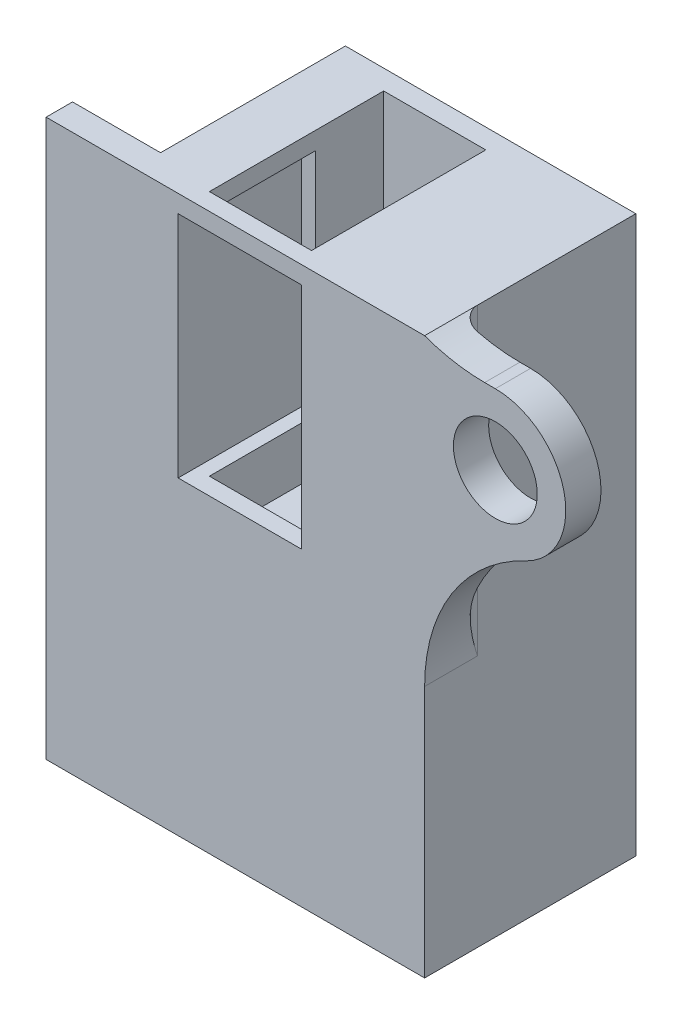
ISO-10303-21;
HEADER;
FILE_DESCRIPTION(('STEP AP214'),'2;1');
FILE_NAME('part.step','',(''),(''),'','','');
FILE_SCHEMA(('AUTOMOTIVE_DESIGN { 1 0 10303 214 1 1 1 1 }'));
ENDSEC;
DATA;
#1=APPLICATION_CONTEXT('core data for automotive mechanical design processes');
#2=APPLICATION_PROTOCOL_DEFINITION('international standard','automotive_design',2000,#1);
#3=PRODUCT_CONTEXT('',#1,'mechanical');
#4=PRODUCT('Part','Part','',(#3));
#5=PRODUCT_RELATED_PRODUCT_CATEGORY('part','',(#4));
#6=PRODUCT_DEFINITION_FORMATION('','',#4);
#7=PRODUCT_DEFINITION_CONTEXT('part definition',#1,'design');
#8=PRODUCT_DEFINITION('design','',#6,#7);
#9=PRODUCT_DEFINITION_SHAPE('','',#8);
#10=(LENGTH_UNIT() NAMED_UNIT(*) SI_UNIT(.MILLI.,.METRE.));
#11=(NAMED_UNIT(*) PLANE_ANGLE_UNIT() SI_UNIT($,.RADIAN.));
#12=(NAMED_UNIT(*) SI_UNIT($,.STERADIAN.) SOLID_ANGLE_UNIT());
#13=UNCERTAINTY_MEASURE_WITH_UNIT(LENGTH_MEASURE(1.E-05),#10,'distance_accuracy_value','');
#14=(GEOMETRIC_REPRESENTATION_CONTEXT(3) GLOBAL_UNCERTAINTY_ASSIGNED_CONTEXT((#13)) GLOBAL_UNIT_ASSIGNED_CONTEXT((#10,
#11,#12)) REPRESENTATION_CONTEXT('',''));
#15=CARTESIAN_POINT('',(0.,0.,0.));
#16=DIRECTION('',(0.,0.,1.));
#17=DIRECTION('',(1.,0.,0.));
#18=AXIS2_PLACEMENT_3D('',#15,#16,#17);
#19=CARTESIAN_POINT('',(0.,0.,-7.));
#20=DIRECTION('',(0.,0.,1.));
#21=DIRECTION('',(1.,0.,0.));
#22=AXIS2_PLACEMENT_3D('',#19,#20,#21);
#23=PLANE('',#22);
#24=DIRECTION('',(0.,-1.,0.));
#25=VECTOR('',#24,1.);
#26=CARTESIAN_POINT('',(3.3,0.,-7.));
#27=LINE('',#26,#25);
#28=CARTESIAN_POINT('',(3.3,32.6,-7.));
#29=VERTEX_POINT('',#28);
#30=CARTESIAN_POINT('',(3.3,19.6,-7.));
#31=VERTEX_POINT('',#30);
#32=EDGE_CURVE('E279',#29,#31,#27,.T.);
#33=ORIENTED_EDGE('',*,*,#32,.F.);
#34=DIRECTION('',(-1.,0.,0.));
#35=VECTOR('',#34,1.);
#36=CARTESIAN_POINT('',(0.,32.6,-7.));
#37=LINE('',#36,#35);
#38=CARTESIAN_POINT('',(2.5,32.6,-7.));
#39=VERTEX_POINT('',#38);
#40=EDGE_CURVE('E345',#29,#39,#37,.T.);
#41=ORIENTED_EDGE('',*,*,#40,.T.);
#42=DIRECTION('',(0.,-1.,0.));
#43=VECTOR('',#42,1.);
#44=CARTESIAN_POINT('',(2.50000000000001,0.,-7.));
#45=LINE('',#44,#43);
#46=CARTESIAN_POINT('',(2.5,19.6,-7.));
#47=VERTEX_POINT('',#46);
#48=EDGE_CURVE('E351',#39,#47,#45,.T.);
#49=ORIENTED_EDGE('',*,*,#48,.T.);
#50=DIRECTION('',(1.,0.,0.));
#51=VECTOR('',#50,1.);
#52=CARTESIAN_POINT('',(0.,19.6,-7.));
#53=LINE('',#52,#51);
#54=EDGE_CURVE('E356',#47,#31,#53,.T.);
#55=ORIENTED_EDGE('',*,*,#54,.T.);
#56=EDGE_LOOP('',(#33,#41,#49,#55));
#57=FACE_BOUND('',#56,.T.);
#58=ADVANCED_FACE('F43',(#57),#23,.T.);
#59=CARTESIAN_POINT('',(0.,0.,0.));
#60=DIRECTION('',(1.,0.,0.));
#61=DIRECTION('',(0.,0.,-1.));
#62=AXIS2_PLACEMENT_3D('',#59,#60,#61);
#63=PLANE('',#62);
#64=DIRECTION('',(0.,0.,1.));
#65=VECTOR('',#64,1.);
#66=CARTESIAN_POINT('',(0.,33.6,-12.));
#67=LINE('',#66,#65);
#68=CARTESIAN_POINT('',(0.,33.6,-12.));
#69=VERTEX_POINT('',#68);
#70=CARTESIAN_POINT('',(0.,33.6,-1.5));
#71=VERTEX_POINT('',#70);
#72=EDGE_CURVE('E304',#69,#71,#67,.T.);
#73=ORIENTED_EDGE('',*,*,#72,.F.);
#74=DIRECTION('',(0.,1.,0.));
#75=VECTOR('',#74,1.);
#76=CARTESIAN_POINT('',(0.,2.,-12.));
#77=LINE('',#76,#75);
#78=CARTESIAN_POINT('',(0.,2.,-12.));
#79=VERTEX_POINT('',#78);
#80=EDGE_CURVE('E288',#79,#69,#77,.T.);
#81=ORIENTED_EDGE('',*,*,#80,.F.);
#82=DIRECTION('',(0.,0.,1.));
#83=VECTOR('',#82,1.);
#84=CARTESIAN_POINT('',(0.,2.,-12.));
#85=LINE('',#84,#83);
#86=CARTESIAN_POINT('',(0.,2.,-1.5));
#87=VERTEX_POINT('',#86);
#88=EDGE_CURVE('E422',#79,#87,#85,.T.);
#89=ORIENTED_EDGE('',*,*,#88,.T.);
#90=DIRECTION('',(0.,-1.,0.));
#91=VECTOR('',#90,1.);
#92=CARTESIAN_POINT('',(0.,37.1,-1.5));
#93=LINE('',#92,#91);
#94=EDGE_CURVE('E321',#71,#87,#93,.T.);
#95=ORIENTED_EDGE('',*,*,#94,.F.);
#96=EDGE_LOOP('',(#73,#81,#89,#95));
#97=FACE_BOUND('',#96,.T.);
#98=ADVANCED_FACE('F492',(#97),#63,.F.);
#99=CARTESIAN_POINT('',(16.5,0.,0.));
#100=DIRECTION('',(0.,0.,-1.));
#101=DIRECTION('',(-1.,0.,0.));
#102=AXIS2_PLACEMENT_3D('',#99,#100,#101);
#103=PLANE('',#102);
#104=DIRECTION('',(-1.,0.,0.));
#105=VECTOR('',#104,1.);
#106=CARTESIAN_POINT('',(0.,32.6,0.));
#107=LINE('',#106,#105);
#108=CARTESIAN_POINT('',(9.5,32.6,0.));
#109=VERTEX_POINT('',#108);
#110=CARTESIAN_POINT('',(2.5,32.6,0.));
#111=VERTEX_POINT('',#110);
#112=EDGE_CURVE('E363',#109,#111,#107,.T.);
#113=ORIENTED_EDGE('',*,*,#112,.F.);
#114=DIRECTION('',(0.,1.,0.));
#115=VECTOR('',#114,1.);
#116=CARTESIAN_POINT('',(9.5,0.,0.));
#117=LINE('',#116,#115);
#118=CARTESIAN_POINT('',(9.5,19.6,0.));
#119=VERTEX_POINT('',#118);
#120=EDGE_CURVE('E340',#119,#109,#117,.T.);
#121=ORIENTED_EDGE('',*,*,#120,.F.);
#122=DIRECTION('',(1.,0.,0.));
#123=VECTOR('',#122,1.);
#124=CARTESIAN_POINT('',(0.,19.6,0.));
#125=LINE('',#124,#123);
#126=CARTESIAN_POINT('',(2.5,19.6,0.));
#127=VERTEX_POINT('',#126);
#128=EDGE_CURVE('E346',#127,#119,#125,.T.);
#129=ORIENTED_EDGE('',*,*,#128,.F.);
#130=DIRECTION('',(0.,-1.,0.));
#131=VECTOR('',#130,1.);
#132=CARTESIAN_POINT('',(2.50000000000001,0.,0.));
#133=LINE('',#132,#131);
#134=EDGE_CURVE('E367',#111,#127,#133,.T.);
#135=ORIENTED_EDGE('',*,*,#134,.F.);
#136=EDGE_LOOP('',(#113,#121,#129,#135));
#137=FACE_BOUND('',#136,.T.);
#138=CARTESIAN_POINT('',(20.5182193377738,29.,0.));
#139=DIRECTION('',(0.,0.,-1.));
#140=DIRECTION('',(-1.,0.,0.));
#141=AXIS2_PLACEMENT_3D('',#138,#139,#140);
#142=CIRCLE('',#141,2.38125);
#143=CARTESIAN_POINT('',(18.1369693377738,29.,0.));
#144=VERTEX_POINT('',#143);
#145=EDGE_CURVE('E398',#144,#144,#142,.T.);
#146=ORIENTED_EDGE('',*,*,#145,.T.);
#147=EDGE_LOOP('',(#146));
#148=FACE_BOUND('',#147,.T.);
#149=DIRECTION('',(-1.,0.,0.));
#150=VECTOR('',#149,1.);
#151=CARTESIAN_POINT('',(0.,33.,0.));
#152=LINE('',#151,#150);
#153=CARTESIAN_POINT('',(20.5182193377738,33.,0.));
#154=VERTEX_POINT('',#153);
#155=CARTESIAN_POINT('',(19.9117444218464,33.,0.));
#156=VERTEX_POINT('',#155);
#157=EDGE_CURVE('E408',#154,#156,#152,.T.);
#158=ORIENTED_EDGE('',*,*,#157,.T.);
#159=CARTESIAN_POINT('',(19.9117444218464,43.,0.));
#160=DIRECTION('',(0.,0.,-1.));
#161=DIRECTION('',(-1.,0.,0.));
#162=AXIS2_PLACEMENT_3D('',#159,#160,#161);
#163=CIRCLE('',#162,10.);
#164=CARTESIAN_POINT('',(16.5,33.6,0.));
#165=VERTEX_POINT('',#164);
#166=EDGE_CURVE('E439',#156,#165,#163,.T.);
#167=ORIENTED_EDGE('',*,*,#166,.T.);
#168=DIRECTION('',(1.,0.,0.));
#169=VECTOR('',#168,1.);
#170=CARTESIAN_POINT('',(-5.,33.6,0.));
#171=LINE('',#170,#169);
#172=CARTESIAN_POINT('',(-5.,33.6,0.));
#173=VERTEX_POINT('',#172);
#174=EDGE_CURVE('E313',#173,#165,#171,.T.);
#175=ORIENTED_EDGE('',*,*,#174,.F.);
#176=DIRECTION('',(0.,1.,0.));
#177=VECTOR('',#176,1.);
#178=CARTESIAN_POINT('',(-5.,2.,0.));
#179=LINE('',#178,#177);
#180=CARTESIAN_POINT('',(-5.,2.,0.));
#181=VERTEX_POINT('',#180);
#182=EDGE_CURVE('E322',#181,#173,#179,.T.);
#183=ORIENTED_EDGE('',*,*,#182,.F.);
#184=DIRECTION('',(1.,0.,0.));
#185=VECTOR('',#184,1.);
#186=CARTESIAN_POINT('',(0.,2.,0.));
#187=LINE('',#186,#185);
#188=CARTESIAN_POINT('',(16.5,2.,0.));
#189=VERTEX_POINT('',#188);
#190=EDGE_CURVE('E425',#181,#189,#187,.T.);
#191=ORIENTED_EDGE('',*,*,#190,.T.);
#192=DIRECTION('',(0.,-1.,0.));
#193=VECTOR('',#192,1.);
#194=CARTESIAN_POINT('',(16.5,0.,0.));
#195=LINE('',#194,#193);
#196=CARTESIAN_POINT('',(16.5,16.342263231169,0.));
#197=VERTEX_POINT('',#196);
#198=EDGE_CURVE('E431',#197,#189,#195,.T.);
#199=ORIENTED_EDGE('',*,*,#198,.F.);
#200=CARTESIAN_POINT('',(26.5,16.342263231169,0.));
#201=DIRECTION('',(0.,0.,-1.));
#202=DIRECTION('',(-1.,0.,0.));
#203=AXIS2_PLACEMENT_3D('',#200,#201,#202);
#204=CIRCLE('',#203,10.);
#205=CARTESIAN_POINT('',(22.2272995269813,25.383503780334,0.));
#206=VERTEX_POINT('',#205);
#207=EDGE_CURVE('E452',#197,#206,#204,.T.);
#208=ORIENTED_EDGE('',*,*,#207,.T.);
#209=CARTESIAN_POINT('',(20.5182193377738,29.,0.));
#210=DIRECTION('',(0.,0.,1.));
#211=DIRECTION('',(1.,0.,0.));
#212=AXIS2_PLACEMENT_3D('',#209,#210,#211);
#213=CIRCLE('',#212,4.);
#214=EDGE_CURVE('E402',#154,#206,#213,.F.);
#215=ORIENTED_EDGE('',*,*,#214,.F.);
#216=EDGE_LOOP('',(#158,#167,#175,#183,#191,#199,#208,#215));
#217=FACE_BOUND('',#216,.T.);
#218=ADVANCED_FACE('F480',(#137,#148,#217),#103,.F.);
#219=CARTESIAN_POINT('',(16.5,0.,0.));
#220=DIRECTION('',(1.,0.,0.));
#221=DIRECTION('',(0.,0.,-1.));
#222=AXIS2_PLACEMENT_3D('',#219,#220,#221);
#223=PLANE('',#222);
#224=DIRECTION('',(0.,0.,1.));
#225=VECTOR('',#224,1.);
#226=CARTESIAN_POINT('',(16.5,2.,-12.));
#227=LINE('',#226,#225);
#228=CARTESIAN_POINT('',(16.5,2.,-12.));
#229=VERTEX_POINT('',#228);
#230=EDGE_CURVE('E421',#229,#189,#227,.T.);
#231=ORIENTED_EDGE('',*,*,#230,.F.);
#232=DIRECTION('',(0.,-1.,0.));
#233=VECTOR('',#232,1.);
#234=CARTESIAN_POINT('',(16.5,2.,-12.));
#235=LINE('',#234,#233);
#236=CARTESIAN_POINT('',(16.5,33.6,-12.));
#237=VERTEX_POINT('',#236);
#238=EDGE_CURVE('E296',#237,#229,#235,.T.);
#239=ORIENTED_EDGE('',*,*,#238,.F.);
#240=DIRECTION('',(0.,0.,-1.));
#241=VECTOR('',#240,1.);
#242=CARTESIAN_POINT('',(16.5,33.6,0.));
#243=LINE('',#242,#241);
#244=CARTESIAN_POINT('',(16.5,33.6,-3.));
#245=VERTEX_POINT('',#244);
#246=EDGE_CURVE('E317',#245,#237,#243,.T.);
#247=ORIENTED_EDGE('',*,*,#246,.F.);
#248=DIRECTION('',(0.,1.,0.));
#249=VECTOR('',#248,1.);
#250=CARTESIAN_POINT('',(16.5,0.,-3.));
#251=LINE('',#250,#249);
#252=CARTESIAN_POINT('',(16.5,16.342263231169,-3.));
#253=VERTEX_POINT('',#252);
#254=EDGE_CURVE('E463',#245,#253,#251,.F.);
#255=ORIENTED_EDGE('',*,*,#254,.T.);
#256=DIRECTION('',(0.,0.,1.));
#257=VECTOR('',#256,1.);
#258=CARTESIAN_POINT('',(16.5,16.342263231169,0.));
#259=LINE('',#258,#257);
#260=EDGE_CURVE('E445',#253,#197,#259,.T.);
#261=ORIENTED_EDGE('',*,*,#260,.T.);
#262=ORIENTED_EDGE('',*,*,#198,.T.);
#263=EDGE_LOOP('',(#231,#239,#247,#255,#261,#262));
#264=FACE_BOUND('',#263,.T.);
#265=ADVANCED_FACE('F588',(#264),#223,.T.);
#266=CARTESIAN_POINT('',(0.,2.,-12.));
#267=DIRECTION('',(0.,1.,0.));
#268=DIRECTION('',(0.,0.,1.));
#269=AXIS2_PLACEMENT_3D('',#266,#267,#268);
#270=PLANE('',#269);
#271=CARTESIAN_POINT('',(8.25,2.,-6.));
#272=DIRECTION('',(0.,-1.,0.));
#273=DIRECTION('',(0.,0.,-1.));
#274=AXIS2_PLACEMENT_3D('',#271,#272,#273);
#275=CIRCLE('',#274,2.38125);
#276=CARTESIAN_POINT('',(8.25,2.,-8.38125));
#277=VERTEX_POINT('',#276);
#278=EDGE_CURVE('E377',#277,#277,#275,.T.);
#279=ORIENTED_EDGE('',*,*,#278,.F.);
#280=EDGE_LOOP('',(#279));
#281=FACE_BOUND('',#280,.T.);
#282=ORIENTED_EDGE('',*,*,#88,.F.);
#283=DIRECTION('',(-1.,0.,0.));
#284=VECTOR('',#283,1.);
#285=CARTESIAN_POINT('',(0.,2.,-12.));
#286=LINE('',#285,#284);
#287=EDGE_CURVE('E300',#229,#79,#286,.T.);
#288=ORIENTED_EDGE('',*,*,#287,.F.);
#289=ORIENTED_EDGE('',*,*,#230,.T.);
#290=ORIENTED_EDGE('',*,*,#190,.F.);
#291=DIRECTION('',(0.,0.,1.));
#292=VECTOR('',#291,1.);
#293=CARTESIAN_POINT('',(-5.,2.,-1.5));
#294=LINE('',#293,#292);
#295=CARTESIAN_POINT('',(-5.,2.,-1.5));
#296=VERTEX_POINT('',#295);
#297=EDGE_CURVE('E329',#296,#181,#294,.T.);
#298=ORIENTED_EDGE('',*,*,#297,.F.);
#299=DIRECTION('',(1.,0.,0.));
#300=VECTOR('',#299,1.);
#301=CARTESIAN_POINT('',(-5.,2.,-1.5));
#302=LINE('',#301,#300);
#303=EDGE_CURVE('E333',#296,#87,#302,.T.);
#304=ORIENTED_EDGE('',*,*,#303,.T.);
#305=EDGE_LOOP('',(#282,#288,#289,#290,#298,#304));
#306=FACE_BOUND('',#305,.T.);
#307=ADVANCED_FACE('F577',(#281,#306),#270,.F.);
#308=CARTESIAN_POINT('',(20.5182193377738,29.,-2.));
#309=DIRECTION('',(0.,0.,1.));
#310=DIRECTION('',(1.,0.,0.));
#311=AXIS2_PLACEMENT_3D('',#308,#309,#310);
#312=CYLINDRICAL_SURFACE('',#311,4.);
#313=ORIENTED_EDGE('',*,*,#214,.T.);
#314=DIRECTION('',(0.,0.,1.));
#315=VECTOR('',#314,1.);
#316=CARTESIAN_POINT('',(22.2272995269813,25.383503780334,-2.));
#317=LINE('',#316,#315);
#318=CARTESIAN_POINT('',(22.2272995269813,25.383503780334,-2.));
#319=VERTEX_POINT('',#318);
#320=EDGE_CURVE('E449',#206,#319,#317,.F.);
#321=ORIENTED_EDGE('',*,*,#320,.T.);
#322=CARTESIAN_POINT('',(20.5182193377738,29.,-2.));
#323=DIRECTION('',(0.,0.,1.));
#324=DIRECTION('',(1.,0.,0.));
#325=AXIS2_PLACEMENT_3D('',#322,#323,#324);
#326=CIRCLE('',#325,4.);
#327=CARTESIAN_POINT('',(20.5182193377738,33.,-2.));
#328=VERTEX_POINT('',#327);
#329=EDGE_CURVE('E403',#328,#319,#326,.F.);
#330=ORIENTED_EDGE('',*,*,#329,.F.);
#331=DIRECTION('',(0.,0.,1.));
#332=VECTOR('',#331,1.);
#333=CARTESIAN_POINT('',(20.5182193377738,33.,-2.));
#334=LINE('',#333,#332);
#335=EDGE_CURVE('E412',#328,#154,#334,.T.);
#336=ORIENTED_EDGE('',*,*,#335,.T.);
#337=EDGE_LOOP('',(#313,#321,#330,#336));
#338=FACE_BOUND('',#337,.T.);
#339=ADVANCED_FACE('F597',(#338),#312,.T.);
#340=CARTESIAN_POINT('',(0.,33.,-2.));
#341=DIRECTION('',(0.,1.,0.));
#342=DIRECTION('',(0.,0.,1.));
#343=AXIS2_PLACEMENT_3D('',#340,#341,#342);
#344=PLANE('',#343);
#345=DIRECTION('',(-1.,0.,0.));
#346=VECTOR('',#345,1.);
#347=CARTESIAN_POINT('',(0.,33.,-2.));
#348=LINE('',#347,#346);
#349=CARTESIAN_POINT('',(19.9117444218464,33.,-2.));
#350=VERTEX_POINT('',#349);
#351=EDGE_CURVE('E407',#328,#350,#348,.T.);
#352=ORIENTED_EDGE('',*,*,#351,.T.);
#353=DIRECTION('',(0.,0.,1.));
#354=VECTOR('',#353,1.);
#355=CARTESIAN_POINT('',(19.9117444218464,33.,0.));
#356=LINE('',#355,#354);
#357=EDGE_CURVE('E435',#350,#156,#356,.T.);
#358=ORIENTED_EDGE('',*,*,#357,.T.);
#359=ORIENTED_EDGE('',*,*,#157,.F.);
#360=ORIENTED_EDGE('',*,*,#335,.F.);
#361=EDGE_LOOP('',(#352,#358,#359,#360));
#362=FACE_BOUND('',#361,.T.);
#363=ADVANCED_FACE('F603',(#362),#344,.T.);
#364=CARTESIAN_POINT('',(0.,0.,-2.));
#365=DIRECTION('',(0.,0.,1.));
#366=DIRECTION('',(1.,0.,0.));
#367=AXIS2_PLACEMENT_3D('',#364,#365,#366);
#368=PLANE('',#367);
#369=CARTESIAN_POINT('',(20.5182193377738,29.,-2.));
#370=DIRECTION('',(0.,0.,-1.));
#371=DIRECTION('',(-1.,0.,0.));
#372=AXIS2_PLACEMENT_3D('',#369,#370,#371);
#373=CIRCLE('',#372,2.38125);
#374=CARTESIAN_POINT('',(18.1369693377738,29.,-2.));
#375=VERTEX_POINT('',#374);
#376=EDGE_CURVE('E391',#375,#375,#373,.T.);
#377=ORIENTED_EDGE('',*,*,#376,.F.);
#378=EDGE_LOOP('',(#377));
#379=FACE_BOUND('',#378,.T.);
#380=CARTESIAN_POINT('',(26.5,16.342263231169,-2.));
#381=DIRECTION('',(0.,0.,1.));
#382=DIRECTION('',(1.,0.,0.));
#383=AXIS2_PLACEMENT_3D('',#380,#381,#382);
#384=CIRCLE('',#383,10.);
#385=CARTESIAN_POINT('',(17.5,20.7011621747097,-2.));
#386=VERTEX_POINT('',#385);
#387=EDGE_CURVE('E455',#319,#386,#384,.T.);
#388=ORIENTED_EDGE('',*,*,#387,.T.);
#389=DIRECTION('',(0.,1.,0.));
#390=VECTOR('',#389,1.);
#391=CARTESIAN_POINT('',(17.5,0.,-2.));
#392=LINE('',#391,#390);
#393=CARTESIAN_POINT('',(17.5,33.2951821839,-2.));
#394=VERTEX_POINT('',#393);
#395=EDGE_CURVE('E459',#386,#394,#392,.T.);
#396=ORIENTED_EDGE('',*,*,#395,.T.);
#397=CARTESIAN_POINT('',(19.9117444218464,43.,-2.));
#398=DIRECTION('',(0.,0.,1.));
#399=DIRECTION('',(1.,0.,0.));
#400=AXIS2_PLACEMENT_3D('',#397,#398,#399);
#401=CIRCLE('',#400,10.);
#402=EDGE_CURVE('E442',#394,#350,#401,.T.);
#403=ORIENTED_EDGE('',*,*,#402,.T.);
#404=ORIENTED_EDGE('',*,*,#351,.F.);
#405=ORIENTED_EDGE('',*,*,#329,.T.);
#406=EDGE_LOOP('',(#388,#396,#403,#404,#405));
#407=FACE_BOUND('',#406,.T.);
#408=ADVANCED_FACE('F600',(#379,#407),#368,.F.);
#409=CARTESIAN_POINT('',(20.5182193377738,29.,10.6066017177982));
#410=DIRECTION('',(0.,0.,-1.));
#411=DIRECTION('',(-1.,0.,0.));
#412=AXIS2_PLACEMENT_3D('',#409,#410,#411);
#413=CYLINDRICAL_SURFACE('',#412,2.38125);
#414=ORIENTED_EDGE('',*,*,#376,.T.);
#415=EDGE_LOOP('',(#414));
#416=FACE_BOUND('',#415,.T.);
#417=ORIENTED_EDGE('',*,*,#145,.F.);
#418=EDGE_LOOP('',(#417));
#419=FACE_BOUND('',#418,.T.);
#420=ADVANCED_FACE('F610',(#416,#419),#413,.F.);
#421=CARTESIAN_POINT('',(8.25,8.35,-6.));
#422=DIRECTION('',(0.,-1.,0.));
#423=DIRECTION('',(0.,0.,-1.));
#424=AXIS2_PLACEMENT_3D('',#421,#422,#423);
#425=CYLINDRICAL_SURFACE('',#424,2.38125);
#426=CARTESIAN_POINT('',(8.25,8.35,-6.));
#427=DIRECTION('',(0.,-1.,0.));
#428=DIRECTION('',(0.,0.,-1.));
#429=AXIS2_PLACEMENT_3D('',#426,#427,#428);
#430=CIRCLE('',#429,2.38125);
#431=CARTESIAN_POINT('',(8.25,8.35,-8.38125));
#432=VERTEX_POINT('',#431);
#433=EDGE_CURVE('E387',#432,#432,#430,.T.);
#434=ORIENTED_EDGE('',*,*,#433,.F.);
#435=EDGE_LOOP('',(#434));
#436=FACE_BOUND('',#435,.T.);
#437=ORIENTED_EDGE('',*,*,#278,.T.);
#438=EDGE_LOOP('',(#437));
#439=FACE_BOUND('',#438,.T.);
#440=ADVANCED_FACE('F633',(#436,#439),#425,.F.);
#441=CARTESIAN_POINT('',(0.,8.35,0.));
#442=DIRECTION('',(0.,-1.,0.));
#443=DIRECTION('',(0.,0.,-1.));
#444=AXIS2_PLACEMENT_3D('',#441,#442,#443);
#445=PLANE('',#444);
#446=ORIENTED_EDGE('',*,*,#433,.T.);
#447=EDGE_LOOP('',(#446));
#448=FACE_BOUND('',#447,.T.);
#449=ADVANCED_FACE('F638',(#448),#445,.T.);
#450=CARTESIAN_POINT('',(9.5,0.,-7.));
#451=DIRECTION('',(1.,0.,0.));
#452=DIRECTION('',(0.,0.,-1.));
#453=AXIS2_PLACEMENT_3D('',#450,#451,#452);
#454=PLANE('',#453);
#455=ORIENTED_EDGE('',*,*,#120,.T.);
#456=DIRECTION('',(0.,0.,1.));
#457=VECTOR('',#456,1.);
#458=CARTESIAN_POINT('',(9.5,32.6,-7.));
#459=LINE('',#458,#457);
#460=CARTESIAN_POINT('',(9.5,32.6,-7.));
#461=VERTEX_POINT('',#460);
#462=EDGE_CURVE('E360',#461,#109,#459,.T.);
#463=ORIENTED_EDGE('',*,*,#462,.F.);
#464=DIRECTION('',(0.,1.,0.));
#465=VECTOR('',#464,1.);
#466=CARTESIAN_POINT('',(9.5,0.,-7.));
#467=LINE('',#466,#465);
#468=CARTESIAN_POINT('',(9.5,19.6,-7.));
#469=VERTEX_POINT('',#468);
#470=EDGE_CURVE('E341',#469,#461,#467,.T.);
#471=ORIENTED_EDGE('',*,*,#470,.F.);
#472=DIRECTION('',(0.,0.,1.));
#473=VECTOR('',#472,1.);
#474=CARTESIAN_POINT('',(9.5,19.6,-7.));
#475=LINE('',#474,#473);
#476=EDGE_CURVE('E374',#469,#119,#475,.T.);
#477=ORIENTED_EDGE('',*,*,#476,.T.);
#478=EDGE_LOOP('',(#455,#463,#471,#477));
#479=FACE_BOUND('',#478,.T.);
#480=ADVANCED_FACE('F644',(#479),#454,.F.);
#481=CARTESIAN_POINT('',(0.,19.6,-7.));
#482=DIRECTION('',(0.,-1.,0.));
#483=DIRECTION('',(0.,0.,-1.));
#484=AXIS2_PLACEMENT_3D('',#481,#482,#483);
#485=PLANE('',#484);
#486=DIRECTION('',(-1.,0.,0.));
#487=VECTOR('',#486,1.);
#488=CARTESIAN_POINT('',(0.,19.6,-0.975));
#489=LINE('',#488,#487);
#490=CARTESIAN_POINT('',(9.1,19.6,-0.975));
#491=VERTEX_POINT('',#490);
#492=CARTESIAN_POINT('',(3.3,19.6,-0.975));
#493=VERTEX_POINT('',#492);
#494=EDGE_CURVE('E267',#491,#493,#489,.T.);
#495=ORIENTED_EDGE('',*,*,#494,.T.);
#496=DIRECTION('',(0.,0.,-1.));
#497=VECTOR('',#496,1.);
#498=CARTESIAN_POINT('',(3.3,19.6,-7.));
#499=LINE('',#498,#497);
#500=EDGE_CURVE('E214',#493,#31,#499,.T.);
#501=ORIENTED_EDGE('',*,*,#500,.T.);
#502=ORIENTED_EDGE('',*,*,#54,.F.);
#503=DIRECTION('',(0.,0.,1.));
#504=VECTOR('',#503,1.);
#505=CARTESIAN_POINT('',(2.5,19.6,-7.));
#506=LINE('',#505,#504);
#507=EDGE_CURVE('E378',#47,#127,#506,.T.);
#508=ORIENTED_EDGE('',*,*,#507,.T.);
#509=ORIENTED_EDGE('',*,*,#128,.T.);
#510=ORIENTED_EDGE('',*,*,#476,.F.);
#511=CARTESIAN_POINT('',(9.1,19.6,-7.));
#512=VERTEX_POINT('',#511);
#513=EDGE_CURVE('E355',#512,#469,#53,.T.);
#514=ORIENTED_EDGE('',*,*,#513,.F.);
#515=DIRECTION('',(0.,0.,1.));
#516=VECTOR('',#515,1.);
#517=CARTESIAN_POINT('',(9.1,19.6,-7.));
#518=LINE('',#517,#516);
#519=EDGE_CURVE('E64',#512,#491,#518,.T.);
#520=ORIENTED_EDGE('',*,*,#519,.T.);
#521=EDGE_LOOP('',(#495,#501,#502,#508,#509,#510,#514,#520));
#522=FACE_BOUND('',#521,.T.);
#523=ADVANCED_FACE('F523',(#522),#485,.F.);
#524=CARTESIAN_POINT('',(2.50000000000001,0.,-7.));
#525=DIRECTION('',(-1.,0.,0.));
#526=DIRECTION('',(0.,-1.,0.));
#527=AXIS2_PLACEMENT_3D('',#524,#525,#526);
#528=PLANE('',#527);
#529=ORIENTED_EDGE('',*,*,#134,.T.);
#530=ORIENTED_EDGE('',*,*,#507,.F.);
#531=ORIENTED_EDGE('',*,*,#48,.F.);
#532=DIRECTION('',(0.,0.,1.));
#533=VECTOR('',#532,1.);
#534=CARTESIAN_POINT('',(2.5,32.6,-7.));
#535=LINE('',#534,#533);
#536=EDGE_CURVE('E381',#39,#111,#535,.T.);
#537=ORIENTED_EDGE('',*,*,#536,.T.);
#538=EDGE_LOOP('',(#529,#530,#531,#537));
#539=FACE_BOUND('',#538,.T.);
#540=ADVANCED_FACE('F516',(#539),#528,.F.);
#541=CARTESIAN_POINT('',(0.,32.6,-7.));
#542=DIRECTION('',(0.,1.,0.));
#543=DIRECTION('',(0.,0.,1.));
#544=AXIS2_PLACEMENT_3D('',#541,#542,#543);
#545=PLANE('',#544);
#546=ORIENTED_EDGE('',*,*,#40,.F.);
#547=DIRECTION('',(0.,0.,1.));
#548=VECTOR('',#547,1.);
#549=CARTESIAN_POINT('',(3.3,32.6,-7.));
#550=LINE('',#549,#548);
#551=CARTESIAN_POINT('',(3.3,32.6,-0.975));
#552=VERTEX_POINT('',#551);
#553=EDGE_CURVE('E282',#29,#552,#550,.T.);
#554=ORIENTED_EDGE('',*,*,#553,.T.);
#555=DIRECTION('',(1.,0.,0.));
#556=VECTOR('',#555,1.);
#557=CARTESIAN_POINT('',(0.,32.6,-0.975));
#558=LINE('',#557,#556);
#559=CARTESIAN_POINT('',(9.1,32.6,-0.975));
#560=VERTEX_POINT('',#559);
#561=EDGE_CURVE('E258',#552,#560,#558,.T.);
#562=ORIENTED_EDGE('',*,*,#561,.T.);
#563=DIRECTION('',(0.,0.,-1.));
#564=VECTOR('',#563,1.);
#565=CARTESIAN_POINT('',(9.1,32.6,-7.));
#566=LINE('',#565,#564);
#567=CARTESIAN_POINT('',(9.1,32.6,-7.));
#568=VERTEX_POINT('',#567);
#569=EDGE_CURVE('E273',#560,#568,#566,.T.);
#570=ORIENTED_EDGE('',*,*,#569,.T.);
#571=EDGE_CURVE('E347',#461,#568,#37,.T.);
#572=ORIENTED_EDGE('',*,*,#571,.F.);
#573=ORIENTED_EDGE('',*,*,#462,.T.);
#574=ORIENTED_EDGE('',*,*,#112,.T.);
#575=ORIENTED_EDGE('',*,*,#536,.F.);
#576=EDGE_LOOP('',(#546,#554,#562,#570,#572,#573,#574,#575));
#577=FACE_BOUND('',#576,.T.);
#578=ADVANCED_FACE('F507',(#577),#545,.F.);
#579=DIRECTION('',(0.,1.,0.));
#580=VECTOR('',#579,1.);
#581=CARTESIAN_POINT('',(9.1,0.,-7.));
#582=LINE('',#581,#580);
#583=EDGE_CURVE('E270',#512,#568,#582,.T.);
#584=ORIENTED_EDGE('',*,*,#583,.F.);
#585=ORIENTED_EDGE('',*,*,#513,.T.);
#586=ORIENTED_EDGE('',*,*,#470,.T.);
#587=ORIENTED_EDGE('',*,*,#571,.T.);
#588=EDGE_LOOP('',(#584,#585,#586,#587));
#589=FACE_BOUND('',#588,.T.);
#590=ADVANCED_FACE('F495',(#589),#23,.T.);
#591=CARTESIAN_POINT('',(-5.,37.1,-1.5));
#592=DIRECTION('',(0.,0.,1.));
#593=DIRECTION('',(0.,-1.,0.));
#594=AXIS2_PLACEMENT_3D('',#591,#592,#593);
#595=PLANE('',#594);
#596=DIRECTION('',(0.,-1.,0.));
#597=VECTOR('',#596,1.);
#598=CARTESIAN_POINT('',(-5.,37.1,-1.5));
#599=LINE('',#598,#597);
#600=CARTESIAN_POINT('',(-5.,33.6,-1.5));
#601=VERTEX_POINT('',#600);
#602=EDGE_CURVE('E326',#601,#296,#599,.T.);
#603=ORIENTED_EDGE('',*,*,#602,.F.);
#604=DIRECTION('',(-1.,0.,0.));
#605=VECTOR('',#604,1.);
#606=CARTESIAN_POINT('',(0.,33.6,-1.5));
#607=LINE('',#606,#605);
#608=EDGE_CURVE('E307',#71,#601,#607,.T.);
#609=ORIENTED_EDGE('',*,*,#608,.F.);
#610=ORIENTED_EDGE('',*,*,#94,.T.);
#611=ORIENTED_EDGE('',*,*,#303,.F.);
#612=EDGE_LOOP('',(#603,#609,#610,#611));
#613=FACE_BOUND('',#612,.T.);
#614=ADVANCED_FACE('F506',(#613),#595,.F.);
#615=CARTESIAN_POINT('',(-5.,0.,0.));
#616=DIRECTION('',(-1.,0.,0.));
#617=DIRECTION('',(0.,0.,1.));
#618=AXIS2_PLACEMENT_3D('',#615,#616,#617);
#619=PLANE('',#618);
#620=DIRECTION('',(0.,0.,1.));
#621=VECTOR('',#620,1.);
#622=CARTESIAN_POINT('',(-5.,33.6,-1.5));
#623=LINE('',#622,#621);
#624=EDGE_CURVE('E310',#601,#173,#623,.T.);
#625=ORIENTED_EDGE('',*,*,#624,.F.);
#626=ORIENTED_EDGE('',*,*,#602,.T.);
#627=ORIENTED_EDGE('',*,*,#297,.T.);
#628=ORIENTED_EDGE('',*,*,#182,.T.);
#629=EDGE_LOOP('',(#625,#626,#627,#628));
#630=FACE_BOUND('',#629,.T.);
#631=ADVANCED_FACE('F514',(#630),#619,.T.);
#632=CARTESIAN_POINT('',(0.,33.6,0.));
#633=DIRECTION('',(0.,-1.,0.));
#634=DIRECTION('',(0.,0.,-1.));
#635=AXIS2_PLACEMENT_3D('',#632,#633,#634);
#636=PLANE('',#635);
#637=DIRECTION('',(1.,0.,0.));
#638=VECTOR('',#637,1.);
#639=CARTESIAN_POINT('',(3.3,33.6,-0.975));
#640=LINE('',#639,#638);
#641=CARTESIAN_POINT('',(3.3,33.6,-0.975));
#642=VERTEX_POINT('',#641);
#643=CARTESIAN_POINT('',(9.1,33.6,-0.975));
#644=VERTEX_POINT('',#643);
#645=EDGE_CURVE('E248',#642,#644,#640,.T.);
#646=ORIENTED_EDGE('',*,*,#645,.F.);
#647=DIRECTION('',(0.,0.,1.));
#648=VECTOR('',#647,1.);
#649=CARTESIAN_POINT('',(3.3,33.6,-10.875));
#650=LINE('',#649,#648);
#651=CARTESIAN_POINT('',(3.3,33.6,-10.875));
#652=VERTEX_POINT('',#651);
#653=EDGE_CURVE('E72',#652,#642,#650,.T.);
#654=ORIENTED_EDGE('',*,*,#653,.F.);
#655=DIRECTION('',(-1.,0.,0.));
#656=VECTOR('',#655,1.);
#657=CARTESIAN_POINT('',(3.3,33.6,-10.875));
#658=LINE('',#657,#656);
#659=CARTESIAN_POINT('',(9.1,33.6,-10.875));
#660=VERTEX_POINT('',#659);
#661=EDGE_CURVE('E235',#660,#652,#658,.T.);
#662=ORIENTED_EDGE('',*,*,#661,.F.);
#663=DIRECTION('',(0.,0.,-1.));
#664=VECTOR('',#663,1.);
#665=CARTESIAN_POINT('',(9.1,33.6,-10.875));
#666=LINE('',#665,#664);
#667=EDGE_CURVE('E239',#644,#660,#666,.T.);
#668=ORIENTED_EDGE('',*,*,#667,.F.);
#669=EDGE_LOOP('',(#646,#654,#662,#668));
#670=FACE_BOUND('',#669,.T.);
#671=ORIENTED_EDGE('',*,*,#246,.T.);
#672=DIRECTION('',(1.,0.,0.));
#673=VECTOR('',#672,1.);
#674=CARTESIAN_POINT('',(0.,33.6,-12.));
#675=LINE('',#674,#673);
#676=EDGE_CURVE('E292',#69,#237,#675,.T.);
#677=ORIENTED_EDGE('',*,*,#676,.F.);
#678=ORIENTED_EDGE('',*,*,#72,.T.);
#679=ORIENTED_EDGE('',*,*,#608,.T.);
#680=ORIENTED_EDGE('',*,*,#624,.T.);
#681=ORIENTED_EDGE('',*,*,#174,.T.);
#682=EDGE_CURVE('E318',#165,#245,#243,.T.);
#683=ORIENTED_EDGE('',*,*,#682,.T.);
#684=EDGE_LOOP('',(#671,#677,#678,#679,#680,#681,#683));
#685=FACE_BOUND('',#684,.T.);
#686=ADVANCED_FACE('F478',(#670,#685),#636,.F.);
#687=CARTESIAN_POINT('',(19.9117444218464,43.,0.));
#688=DIRECTION('',(0.,0.,-1.));
#689=DIRECTION('',(-1.,0.,0.));
#690=AXIS2_PLACEMENT_3D('',#687,#688,#689);
#691=CYLINDRICAL_SURFACE('',#690,10.);
#692=ORIENTED_EDGE('',*,*,#402,.F.);
#693=CARTESIAN_POINT('',(17.5,33.2951821839,-2.));
#694=CARTESIAN_POINT('',(17.4416882046076,33.3096521513916,-1.99996377159555));
#695=CARTESIAN_POINT('',(17.3835448570359,33.3246797672575,-2.00509729641203));
#696=CARTESIAN_POINT('',(17.2691894306341,33.3552970068834,-2.02528178802682));
#697=CARTESIAN_POINT('',(17.2129763122904,33.370886318572,-2.04032732575709));
#698=CARTESIAN_POINT('',(17.1039998442129,33.4020931624776,-2.07991778830303));
#699=CARTESIAN_POINT('',(17.0512370422384,33.417710698773,-2.10446421718611));
#700=CARTESIAN_POINT('',(16.9506212007074,33.4483242872222,-2.16241344629458));
#701=CARTESIAN_POINT('',(16.9027678199665,33.4633203825204,-2.19581563050275));
#702=CARTESIAN_POINT('',(16.8133948734528,33.4919804261872,-2.27063887890849));
#703=CARTESIAN_POINT('',(16.7718704395181,33.5056453954947,-2.31205372362896));
#704=CARTESIAN_POINT('',(16.6964431848553,33.5309227438538,-2.40189151600445));
#705=CARTESIAN_POINT('',(16.6625404522537,33.5425350991717,-2.45031454468144));
#706=CARTESIAN_POINT('',(16.6046947097274,33.5626100803941,-2.55092090933748));
#707=CARTESIAN_POINT('',(16.5804299370159,33.5711732462641,-2.60289915195508));
#708=CARTESIAN_POINT('',(16.5410873005675,33.5851653108669,-2.71058607085887));
#709=CARTESIAN_POINT('',(16.5259962909772,33.590598693939,-2.76628928157378));
#710=CARTESIAN_POINT('',(16.5105487685177,33.5961765065227,-2.85211540040821));
#711=CARTESIAN_POINT('',(16.5065958447039,33.5976080034534,-2.88155237267648));
#712=CARTESIAN_POINT('',(16.5013224671775,33.5995199180946,-2.94065406686891));
#713=CARTESIAN_POINT('',(16.4999986917682,33.600001535888,-2.97031845382046));
#714=CARTESIAN_POINT('',(16.5,33.6,-3.));
#715=B_SPLINE_CURVE_WITH_KNOTS('',3,(#693,#694,#695,#696,#697,#698,#699,#700,#701,#702,#703,
#704,#705,#706,#707,#708,#709,#710,#711,#712,#713,#714),.UNSPECIFIED.,.F.,.F.,(4,2,2,2,2,2,2,2,
2,2,4),(0.,0.179979391065258,0.359860284590325,0.539769666360691,0.719666536695732,
0.899424326151548,1.07918419396243,1.25230100574518,1.42516915555092,1.51425951775296,
1.60323725036706),.UNSPECIFIED.);
#716=EDGE_CURVE('E57',#394,#245,#715,.T.);
#717=ORIENTED_EDGE('',*,*,#716,.T.);
#718=ORIENTED_EDGE('',*,*,#682,.F.);
#719=ORIENTED_EDGE('',*,*,#166,.F.);
#720=ORIENTED_EDGE('',*,*,#357,.F.);
#721=EDGE_LOOP('',(#692,#717,#718,#719,#720));
#722=FACE_BOUND('',#721,.T.);
#723=ADVANCED_FACE('F473',(#722),#691,.F.);
#724=CARTESIAN_POINT('',(26.5,16.342263231169,-2.));
#725=DIRECTION('',(0.,0.,1.));
#726=DIRECTION('',(1.,0.,0.));
#727=AXIS2_PLACEMENT_3D('',#724,#725,#726);
#728=CYLINDRICAL_SURFACE('',#727,10.);
#729=ORIENTED_EDGE('',*,*,#387,.F.);
#730=ORIENTED_EDGE('',*,*,#320,.F.);
#731=ORIENTED_EDGE('',*,*,#207,.F.);
#732=ORIENTED_EDGE('',*,*,#260,.F.);
#733=CARTESIAN_POINT('',(17.5,20.7011621747097,-2.));
#734=CARTESIAN_POINT('',(17.4649705918882,20.6288396959497,-2.00001517907888));
#735=CARTESIAN_POINT('',(17.4308249738421,20.556111587016,-2.00183974990828));
#736=CARTESIAN_POINT('',(17.3643618176126,20.4100074789031,-2.00867500405915));
#737=CARTESIAN_POINT('',(17.3320435036572,20.336631770189,-2.01368432408378));
#738=CARTESIAN_POINT('',(17.2693266347427,20.1894773913306,-2.02644469931918));
#739=CARTESIAN_POINT('',(17.2389244580283,20.1156997864008,-2.03419038738089));
#740=CARTESIAN_POINT('',(17.1799867691033,19.9676874000717,-2.05208658188006));
#741=CARTESIAN_POINT('',(17.1514514850332,19.8934525640055,-2.06223738153228));
#742=CARTESIAN_POINT('',(17.0688926274996,19.6708057930277,-2.09574919733705));
#743=CARTESIAN_POINT('',(17.017647311377,19.5218199539269,-2.12222969644671));
#744=CARTESIAN_POINT('',(16.9225479634451,19.2227266295524,-2.18165298985507));
#745=CARTESIAN_POINT('',(16.8786986935253,19.0726184861419,-2.21459991820859));
#746=CARTESIAN_POINT('',(16.7820109335453,18.7105191846494,-2.29987772594522));
#747=CARTESIAN_POINT('',(16.732746945945,18.4981381547551,-2.35464870463528));
#748=CARTESIAN_POINT('',(16.6484261900647,18.0724702024824,-2.47087286474006));
#749=CARTESIAN_POINT('',(16.6133715529952,17.8591831490567,-2.53232704679311));
#750=CARTESIAN_POINT('',(16.5291314236184,17.2182827355187,-2.72300296786534));
#751=CARTESIAN_POINT('',(16.5008343674646,16.7894961375238,-2.85857288785149));
#752=CARTESIAN_POINT('',(16.5000060646769,16.3549759307317,-2.99597991124583));
#753=CARTESIAN_POINT('',(16.5000000044712,16.3486195087201,-2.99798998882368));
#754=CARTESIAN_POINT('',(16.5,16.342263231169,-3.));
#755=B_SPLINE_CURVE_WITH_KNOTS('',3,(#733,#734,#735,#736,#737,#738,#739,#740,#741,#742,#743,
#744,#745,#746,#747,#748,#749,#750,#751,#752,#753,#754),.UNSPECIFIED.,.F.,.F.,(4,2,2,2,2,2,2,2,
2,2,4),(0.,0.241022397911186,0.481941690674264,0.722391040963445,0.962869720289598,
1.44176483881817,1.92096712310371,2.59465687968437,3.26844764326604,4.61560355969885,
4.63560356796335),.UNSPECIFIED.);
#756=EDGE_CURVE('E11',#253,#386,#755,.F.);
#757=ORIENTED_EDGE('',*,*,#756,.T.);
#758=EDGE_LOOP('',(#729,#730,#731,#732,#757));
#759=FACE_BOUND('',#758,.T.);
#760=ADVANCED_FACE('F477',(#759),#728,.F.);
#761=CARTESIAN_POINT('',(17.5,0.,-3.));
#762=DIRECTION('',(0.,1.,0.));
#763=DIRECTION('',(0.,0.,1.));
#764=AXIS2_PLACEMENT_3D('',#761,#762,#763);
#765=CYLINDRICAL_SURFACE('',#764,1.);
#766=ORIENTED_EDGE('',*,*,#756,.F.);
#767=ORIENTED_EDGE('',*,*,#254,.F.);
#768=ORIENTED_EDGE('',*,*,#716,.F.);
#769=ORIENTED_EDGE('',*,*,#395,.F.);
#770=EDGE_LOOP('',(#766,#767,#768,#769));
#771=FACE_BOUND('',#770,.T.);
#772=ADVANCED_FACE('F45',(#771),#765,.F.);
#773=CARTESIAN_POINT('',(0.,0.,-12.));
#774=DIRECTION('',(0.,0.,-1.));
#775=DIRECTION('',(-1.,0.,0.));
#776=AXIS2_PLACEMENT_3D('',#773,#774,#775);
#777=PLANE('',#776);
#778=ORIENTED_EDGE('',*,*,#80,.T.);
#779=ORIENTED_EDGE('',*,*,#676,.T.);
#780=ORIENTED_EDGE('',*,*,#238,.T.);
#781=ORIENTED_EDGE('',*,*,#287,.T.);
#782=EDGE_LOOP('',(#778,#779,#780,#781));
#783=FACE_BOUND('',#782,.T.);
#784=ADVANCED_FACE('F488',(#783),#777,.T.);
#785=CARTESIAN_POINT('',(3.3,16.6,-10.875));
#786=DIRECTION('',(-1.,0.,0.));
#787=DIRECTION('',(0.,0.,1.));
#788=AXIS2_PLACEMENT_3D('',#785,#786,#787);
#789=PLANE('',#788);
#790=DIRECTION('',(0.,1.,0.));
#791=VECTOR('',#790,1.);
#792=CARTESIAN_POINT('',(3.3,16.6,-0.975));
#793=LINE('',#792,#791);
#794=CARTESIAN_POINT('',(3.3,16.6,-0.975));
#795=VERTEX_POINT('',#794);
#796=EDGE_CURVE('E207',#795,#493,#793,.T.);
#797=ORIENTED_EDGE('',*,*,#796,.F.);
#798=DIRECTION('',(0.,0.,1.));
#799=VECTOR('',#798,1.);
#800=CARTESIAN_POINT('',(3.3,16.6,-10.875));
#801=LINE('',#800,#799);
#802=CARTESIAN_POINT('',(3.3,16.6,-10.875));
#803=VERTEX_POINT('',#802);
#804=EDGE_CURVE('E211',#803,#795,#801,.T.);
#805=ORIENTED_EDGE('',*,*,#804,.F.);
#806=DIRECTION('',(0.,1.,0.));
#807=VECTOR('',#806,1.);
#808=CARTESIAN_POINT('',(3.3,16.6,-10.875));
#809=LINE('',#808,#807);
#810=EDGE_CURVE('E255',#803,#652,#809,.T.);
#811=ORIENTED_EDGE('',*,*,#810,.T.);
#812=ORIENTED_EDGE('',*,*,#653,.T.);
#813=EDGE_CURVE('E219',#552,#642,#793,.T.);
#814=ORIENTED_EDGE('',*,*,#813,.F.);
#815=ORIENTED_EDGE('',*,*,#553,.F.);
#816=ORIENTED_EDGE('',*,*,#32,.T.);
#817=ORIENTED_EDGE('',*,*,#500,.F.);
#818=EDGE_LOOP('',(#797,#805,#811,#812,#814,#815,#816,#817));
#819=FACE_BOUND('',#818,.T.);
#820=ADVANCED_FACE('F209',(#819),#789,.F.);
#821=CARTESIAN_POINT('',(9.1,16.6,-10.875));
#822=DIRECTION('',(1.,0.,0.));
#823=DIRECTION('',(0.,0.,-1.));
#824=AXIS2_PLACEMENT_3D('',#821,#822,#823);
#825=PLANE('',#824);
#826=ORIENTED_EDGE('',*,*,#583,.T.);
#827=ORIENTED_EDGE('',*,*,#569,.F.);
#828=DIRECTION('',(0.,1.,0.));
#829=VECTOR('',#828,1.);
#830=CARTESIAN_POINT('',(9.1,16.6,-0.975));
#831=LINE('',#830,#829);
#832=EDGE_CURVE('E218',#560,#644,#831,.T.);
#833=ORIENTED_EDGE('',*,*,#832,.T.);
#834=ORIENTED_EDGE('',*,*,#667,.T.);
#835=DIRECTION('',(0.,1.,0.));
#836=VECTOR('',#835,1.);
#837=CARTESIAN_POINT('',(9.1,16.6,-10.875));
#838=LINE('',#837,#836);
#839=CARTESIAN_POINT('',(9.1,16.6,-10.875));
#840=VERTEX_POINT('',#839);
#841=EDGE_CURVE('E259',#840,#660,#838,.T.);
#842=ORIENTED_EDGE('',*,*,#841,.F.);
#843=DIRECTION('',(0.,0.,-1.));
#844=VECTOR('',#843,1.);
#845=CARTESIAN_POINT('',(9.1,16.6,-10.875));
#846=LINE('',#845,#844);
#847=CARTESIAN_POINT('',(9.1,16.6,-0.975));
#848=VERTEX_POINT('',#847);
#849=EDGE_CURVE('E229',#848,#840,#846,.T.);
#850=ORIENTED_EDGE('',*,*,#849,.F.);
#851=EDGE_CURVE('E224',#848,#491,#831,.T.);
#852=ORIENTED_EDGE('',*,*,#851,.T.);
#853=ORIENTED_EDGE('',*,*,#519,.F.);
#854=EDGE_LOOP('',(#826,#827,#833,#834,#842,#850,#852,#853));
#855=FACE_BOUND('',#854,.T.);
#856=ADVANCED_FACE('F538',(#855),#825,.F.);
#857=CARTESIAN_POINT('',(3.3,16.6,-0.975));
#858=DIRECTION('',(0.,0.,1.));
#859=DIRECTION('',(1.,0.,0.));
#860=AXIS2_PLACEMENT_3D('',#857,#858,#859);
#861=PLANE('',#860);
#862=ORIENTED_EDGE('',*,*,#851,.F.);
#863=DIRECTION('',(1.,0.,0.));
#864=VECTOR('',#863,1.);
#865=CARTESIAN_POINT('',(3.3,16.6,-0.975));
#866=LINE('',#865,#864);
#867=EDGE_CURVE('E222',#795,#848,#866,.T.);
#868=ORIENTED_EDGE('',*,*,#867,.F.);
#869=ORIENTED_EDGE('',*,*,#796,.T.);
#870=ORIENTED_EDGE('',*,*,#494,.F.);
#871=EDGE_LOOP('',(#862,#868,#869,#870));
#872=FACE_BOUND('',#871,.T.);
#873=ADVANCED_FACE('F223',(#872),#861,.F.);
#874=ORIENTED_EDGE('',*,*,#813,.T.);
#875=ORIENTED_EDGE('',*,*,#645,.T.);
#876=ORIENTED_EDGE('',*,*,#832,.F.);
#877=ORIENTED_EDGE('',*,*,#561,.F.);
#878=EDGE_LOOP('',(#874,#875,#876,#877));
#879=FACE_BOUND('',#878,.T.);
#880=ADVANCED_FACE('F532',(#879),#861,.F.);
#881=CARTESIAN_POINT('',(3.3,16.6,-10.875));
#882=DIRECTION('',(0.,0.,-1.));
#883=DIRECTION('',(-1.,0.,0.));
#884=AXIS2_PLACEMENT_3D('',#881,#882,#883);
#885=PLANE('',#884);
#886=ORIENTED_EDGE('',*,*,#661,.T.);
#887=ORIENTED_EDGE('',*,*,#810,.F.);
#888=DIRECTION('',(-1.,0.,0.));
#889=VECTOR('',#888,1.);
#890=CARTESIAN_POINT('',(3.3,16.6,-10.875));
#891=LINE('',#890,#889);
#892=EDGE_CURVE('E233',#840,#803,#891,.T.);
#893=ORIENTED_EDGE('',*,*,#892,.F.);
#894=ORIENTED_EDGE('',*,*,#841,.T.);
#895=EDGE_LOOP('',(#886,#887,#893,#894));
#896=FACE_BOUND('',#895,.T.);
#897=ADVANCED_FACE('F544',(#896),#885,.F.);
#898=CARTESIAN_POINT('',(0.,16.6,0.));
#899=DIRECTION('',(0.,1.,0.));
#900=DIRECTION('',(0.,0.,1.));
#901=AXIS2_PLACEMENT_3D('',#898,#899,#900);
#902=PLANE('',#901);
#903=ORIENTED_EDGE('',*,*,#804,.T.);
#904=ORIENTED_EDGE('',*,*,#867,.T.);
#905=ORIENTED_EDGE('',*,*,#849,.T.);
#906=ORIENTED_EDGE('',*,*,#892,.T.);
#907=EDGE_LOOP('',(#903,#904,#905,#906));
#908=FACE_BOUND('',#907,.T.);
#909=ADVANCED_FACE('F231',(#908),#902,.T.);
#910=CLOSED_SHELL('',(#58,#98,#218,#265,#307,#339,#363,#408,#420,#440,#449,#480,#523,#540,#578,
#590,#614,#631,#686,#723,#760,#772,#784,#820,#856,#873,#880,#897,#909));
#911=MANIFOLD_SOLID_BREP('B2',#910);
#912=ADVANCED_BREP_SHAPE_REPRESENTATION('',(#18,#911),#14);
#913=SHAPE_DEFINITION_REPRESENTATION(#9,#912);
ENDSEC;
END-ISO-10303-21;
